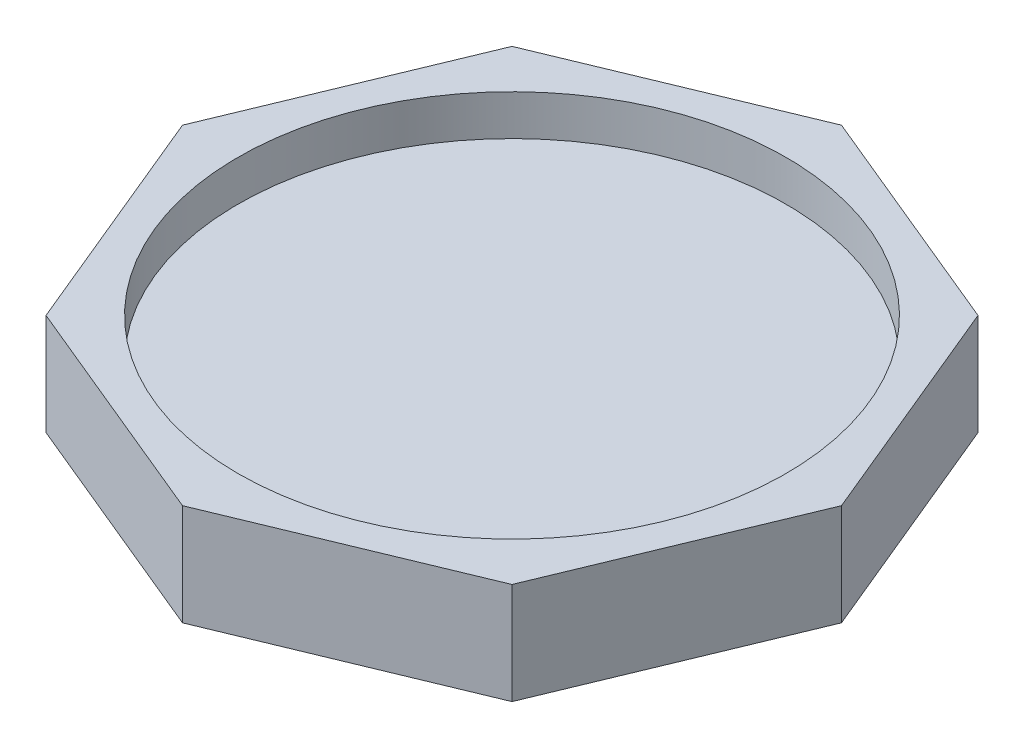
ISO-10303-21;
HEADER;
FILE_DESCRIPTION(('STEP AP214'),'2;1');
FILE_NAME('part.step','',(''),(''),'','','');
FILE_SCHEMA(('AUTOMOTIVE_DESIGN { 1 0 10303 214 1 1 1 1 }'));
ENDSEC;
DATA;
#1=APPLICATION_CONTEXT('core data for automotive mechanical design processes');
#2=APPLICATION_PROTOCOL_DEFINITION('international standard','automotive_design',2000,#1);
#3=PRODUCT_CONTEXT('',#1,'mechanical');
#4=PRODUCT('Part','Part','',(#3));
#5=PRODUCT_RELATED_PRODUCT_CATEGORY('part','',(#4));
#6=PRODUCT_DEFINITION_FORMATION('','',#4);
#7=PRODUCT_DEFINITION_CONTEXT('part definition',#1,'design');
#8=PRODUCT_DEFINITION('design','',#6,#7);
#9=PRODUCT_DEFINITION_SHAPE('','',#8);
#10=(LENGTH_UNIT() NAMED_UNIT(*) SI_UNIT(.MILLI.,.METRE.));
#11=(NAMED_UNIT(*) PLANE_ANGLE_UNIT() SI_UNIT($,.RADIAN.));
#12=(NAMED_UNIT(*) SI_UNIT($,.STERADIAN.) SOLID_ANGLE_UNIT());
#13=UNCERTAINTY_MEASURE_WITH_UNIT(LENGTH_MEASURE(1.E-05),#10,'distance_accuracy_value','');
#14=(GEOMETRIC_REPRESENTATION_CONTEXT(3) GLOBAL_UNCERTAINTY_ASSIGNED_CONTEXT((#13)) GLOBAL_UNIT_ASSIGNED_CONTEXT((#10,
#11,#12)) REPRESENTATION_CONTEXT('',''));
#15=CARTESIAN_POINT('',(0.,0.,0.));
#16=DIRECTION('',(0.,0.,1.));
#17=DIRECTION('',(1.,0.,0.));
#18=AXIS2_PLACEMENT_3D('',#15,#16,#17);
#19=CARTESIAN_POINT('',(114.805029709528,50.,114.805029709526));
#20=DIRECTION('',(-0.923879532511289,0.,-0.382683432365084));
#21=DIRECTION('',(-0.382683432365084,0.,0.923879532511289));
#22=AXIS2_PLACEMENT_3D('',#19,#20,#21);
#23=PLANE('',#22);
#24=DIRECTION('',(0.382683432365084,0.,-0.923879532511289));
#25=VECTOR('',#24,1.);
#26=CARTESIAN_POINT('',(114.805029709528,0.,114.805029709526));
#27=LINE('',#26,#25);
#28=CARTESIAN_POINT('',(114.805029709528,0.,114.805029709526));
#29=VERTEX_POINT('',#28);
#30=CARTESIAN_POINT('',(162.358830043859,0.,-1.012848828571E-12));
#31=VERTEX_POINT('',#30);
#32=EDGE_CURVE('E143',#29,#31,#27,.T.);
#33=ORIENTED_EDGE('',*,*,#32,.T.);
#34=DIRECTION('',(0.,-1.,0.));
#35=VECTOR('',#34,1.);
#36=CARTESIAN_POINT('',(162.358830043859,50.,-1.012848828571E-12));
#37=LINE('',#36,#35);
#38=CARTESIAN_POINT('',(162.358830043859,50.,-1.012848828571E-12));
#39=VERTEX_POINT('',#38);
#40=EDGE_CURVE('E11',#39,#31,#37,.T.);
#41=ORIENTED_EDGE('',*,*,#40,.F.);
#42=DIRECTION('',(0.382683432365084,0.,-0.923879532511289));
#43=VECTOR('',#42,1.);
#44=CARTESIAN_POINT('',(114.805029709528,50.,114.805029709526));
#45=LINE('',#44,#43);
#46=CARTESIAN_POINT('',(114.805029709528,50.,114.805029709526));
#47=VERTEX_POINT('',#46);
#48=EDGE_CURVE('E160',#47,#39,#45,.T.);
#49=ORIENTED_EDGE('',*,*,#48,.F.);
#50=DIRECTION('',(0.,-1.,0.));
#51=VECTOR('',#50,1.);
#52=CARTESIAN_POINT('',(114.805029709528,50.,114.805029709526));
#53=LINE('',#52,#51);
#54=EDGE_CURVE('E136',#47,#29,#53,.T.);
#55=ORIENTED_EDGE('',*,*,#54,.T.);
#56=EDGE_LOOP('',(#33,#41,#49,#55));
#57=FACE_BOUND('',#56,.T.);
#58=ADVANCED_FACE('F44',(#57),#23,.F.);
#59=CARTESIAN_POINT('',(162.358830043859,50.,-1.012848828571E-12));
#60=DIRECTION('',(-0.923879532511284,0.,0.382683432365096));
#61=DIRECTION('',(0.382683432365096,0.,0.923879532511284));
#62=AXIS2_PLACEMENT_3D('',#59,#60,#61);
#63=PLANE('',#62);
#64=DIRECTION('',(-0.382683432365096,0.,-0.923879532511284));
#65=VECTOR('',#64,1.);
#66=CARTESIAN_POINT('',(162.358830043859,0.,-1.012848828571E-12));
#67=LINE('',#66,#65);
#68=CARTESIAN_POINT('',(114.805029709526,0.,-114.805029709528));
#69=VERTEX_POINT('',#68);
#70=EDGE_CURVE('E145',#31,#69,#67,.T.);
#71=ORIENTED_EDGE('',*,*,#70,.T.);
#72=DIRECTION('',(0.,-1.,0.));
#73=VECTOR('',#72,1.);
#74=CARTESIAN_POINT('',(114.805029709526,50.,-114.805029709528));
#75=LINE('',#74,#73);
#76=CARTESIAN_POINT('',(114.805029709526,50.,-114.805029709528));
#77=VERTEX_POINT('',#76);
#78=EDGE_CURVE('E52',#77,#69,#75,.T.);
#79=ORIENTED_EDGE('',*,*,#78,.F.);
#80=DIRECTION('',(-0.382683432365096,0.,-0.923879532511284));
#81=VECTOR('',#80,1.);
#82=CARTESIAN_POINT('',(162.358830043859,50.,-1.012848828571E-12));
#83=LINE('',#82,#81);
#84=EDGE_CURVE('E102',#39,#77,#83,.T.);
#85=ORIENTED_EDGE('',*,*,#84,.F.);
#86=ORIENTED_EDGE('',*,*,#40,.T.);
#87=EDGE_LOOP('',(#71,#79,#85,#86));
#88=FACE_BOUND('',#87,.T.);
#89=ADVANCED_FACE('F216',(#88),#63,.F.);
#90=CARTESIAN_POINT('',(114.805029709526,50.,-114.805029709528));
#91=DIRECTION('',(-0.382683432365084,0.,0.923879532511289));
#92=DIRECTION('',(0.923879532511289,0.,0.382683432365084));
#93=AXIS2_PLACEMENT_3D('',#90,#91,#92);
#94=PLANE('',#93);
#95=DIRECTION('',(-0.923879532511289,0.,-0.382683432365084));
#96=VECTOR('',#95,1.);
#97=CARTESIAN_POINT('',(114.805029709526,0.,-114.805029709528));
#98=LINE('',#97,#96);
#99=CARTESIAN_POINT('',(-1.01368014967304E-12,0.,-162.358830043859));
#100=VERTEX_POINT('',#99);
#101=EDGE_CURVE('E150',#69,#100,#98,.T.);
#102=ORIENTED_EDGE('',*,*,#101,.T.);
#103=DIRECTION('',(0.,-1.,0.));
#104=VECTOR('',#103,1.);
#105=CARTESIAN_POINT('',(-1.01368014967304E-12,50.,-162.358830043859));
#106=LINE('',#105,#104);
#107=CARTESIAN_POINT('',(-1.01368014967304E-12,50.,-162.358830043859));
#108=VERTEX_POINT('',#107);
#109=EDGE_CURVE('E163',#108,#100,#106,.T.);
#110=ORIENTED_EDGE('',*,*,#109,.F.);
#111=DIRECTION('',(-0.923879532511289,0.,-0.382683432365084));
#112=VECTOR('',#111,1.);
#113=CARTESIAN_POINT('',(114.805029709526,50.,-114.805029709528));
#114=LINE('',#113,#112);
#115=EDGE_CURVE('E171',#77,#108,#114,.T.);
#116=ORIENTED_EDGE('',*,*,#115,.F.);
#117=ORIENTED_EDGE('',*,*,#78,.T.);
#118=EDGE_LOOP('',(#102,#110,#116,#117));
#119=FACE_BOUND('',#118,.T.);
#120=ADVANCED_FACE('F168',(#119),#94,.F.);
#121=CARTESIAN_POINT('',(-1.01368014967304E-12,50.,-162.358830043859));
#122=DIRECTION('',(0.382683432365096,0.,0.923879532511284));
#123=DIRECTION('',(0.923879532511284,0.,-0.382683432365096));
#124=AXIS2_PLACEMENT_3D('',#121,#122,#123);
#125=PLANE('',#124);
#126=DIRECTION('',(-0.923879532511284,0.,0.382683432365096));
#127=VECTOR('',#126,1.);
#128=CARTESIAN_POINT('',(-1.01368014967304E-12,0.,-162.358830043859));
#129=LINE('',#128,#127);
#130=CARTESIAN_POINT('',(-114.805029709528,0.,-114.805029709526));
#131=VERTEX_POINT('',#130);
#132=EDGE_CURVE('E149',#100,#131,#129,.T.);
#133=ORIENTED_EDGE('',*,*,#132,.T.);
#134=DIRECTION('',(0.,-1.,0.));
#135=VECTOR('',#134,1.);
#136=CARTESIAN_POINT('',(-114.805029709528,50.,-114.805029709526));
#137=LINE('',#136,#135);
#138=CARTESIAN_POINT('',(-114.805029709528,50.,-114.805029709526));
#139=VERTEX_POINT('',#138);
#140=EDGE_CURVE('E161',#139,#131,#137,.T.);
#141=ORIENTED_EDGE('',*,*,#140,.F.);
#142=DIRECTION('',(-0.923879532511284,0.,0.382683432365096));
#143=VECTOR('',#142,1.);
#144=CARTESIAN_POINT('',(-1.01368014967304E-12,50.,-162.358830043859));
#145=LINE('',#144,#143);
#146=EDGE_CURVE('E184',#108,#139,#145,.T.);
#147=ORIENTED_EDGE('',*,*,#146,.F.);
#148=ORIENTED_EDGE('',*,*,#109,.T.);
#149=EDGE_LOOP('',(#133,#141,#147,#148));
#150=FACE_BOUND('',#149,.T.);
#151=ADVANCED_FACE('F177',(#150),#125,.F.);
#152=CARTESIAN_POINT('',(-114.805029709528,50.,-114.805029709526));
#153=DIRECTION('',(0.923879532511289,0.,0.382683432365084));
#154=DIRECTION('',(0.382683432365084,0.,-0.92387953251129));
#155=AXIS2_PLACEMENT_3D('',#152,#153,#154);
#156=PLANE('',#155);
#157=DIRECTION('',(-0.382683432365084,0.,0.923879532511289));
#158=VECTOR('',#157,1.);
#159=CARTESIAN_POINT('',(-114.805029709528,0.,-114.805029709526));
#160=LINE('',#159,#158);
#161=CARTESIAN_POINT('',(-162.358830043859,0.,9.98994576244845E-13));
#162=VERTEX_POINT('',#161);
#163=EDGE_CURVE('E151',#131,#162,#160,.T.);
#164=ORIENTED_EDGE('',*,*,#163,.T.);
#165=DIRECTION('',(0.,-1.,0.));
#166=VECTOR('',#165,1.);
#167=CARTESIAN_POINT('',(-162.358830043859,50.,9.98994576244845E-13));
#168=LINE('',#167,#166);
#169=CARTESIAN_POINT('',(-162.358830043859,50.,9.98994576244845E-13));
#170=VERTEX_POINT('',#169);
#171=EDGE_CURVE('E131',#170,#162,#168,.T.);
#172=ORIENTED_EDGE('',*,*,#171,.F.);
#173=DIRECTION('',(-0.382683432365084,0.,0.923879532511289));
#174=VECTOR('',#173,1.);
#175=CARTESIAN_POINT('',(-114.805029709528,50.,-114.805029709526));
#176=LINE('',#175,#174);
#177=EDGE_CURVE('E125',#139,#170,#176,.T.);
#178=ORIENTED_EDGE('',*,*,#177,.F.);
#179=ORIENTED_EDGE('',*,*,#140,.T.);
#180=EDGE_LOOP('',(#164,#172,#178,#179));
#181=FACE_BOUND('',#180,.T.);
#182=ADVANCED_FACE('F181',(#181),#156,.F.);
#183=CARTESIAN_POINT('',(-162.358830043859,50.,9.98994576244845E-13));
#184=DIRECTION('',(0.923879532511284,0.,-0.382683432365096));
#185=DIRECTION('',(-0.382683432365096,0.,-0.923879532511284));
#186=AXIS2_PLACEMENT_3D('',#183,#184,#185);
#187=PLANE('',#186);
#188=DIRECTION('',(0.382683432365096,0.,0.923879532511284));
#189=VECTOR('',#188,1.);
#190=CARTESIAN_POINT('',(-162.358830043859,0.,9.98994576244845E-13));
#191=LINE('',#190,#189);
#192=CARTESIAN_POINT('',(-114.805029709526,0.,114.805029709528));
#193=VERTEX_POINT('',#192);
#194=EDGE_CURVE('E134',#162,#193,#191,.T.);
#195=ORIENTED_EDGE('',*,*,#194,.T.);
#196=DIRECTION('',(0.,-1.,0.));
#197=VECTOR('',#196,1.);
#198=CARTESIAN_POINT('',(-114.805029709526,50.,114.805029709528));
#199=LINE('',#198,#197);
#200=CARTESIAN_POINT('',(-114.805029709526,50.,114.805029709528));
#201=VERTEX_POINT('',#200);
#202=EDGE_CURVE('E126',#201,#193,#199,.T.);
#203=ORIENTED_EDGE('',*,*,#202,.F.);
#204=DIRECTION('',(0.382683432365096,0.,0.923879532511284));
#205=VECTOR('',#204,1.);
#206=CARTESIAN_POINT('',(-162.358830043859,50.,9.98994576244845E-13));
#207=LINE('',#206,#205);
#208=EDGE_CURVE('E116',#170,#201,#207,.T.);
#209=ORIENTED_EDGE('',*,*,#208,.F.);
#210=ORIENTED_EDGE('',*,*,#171,.T.);
#211=EDGE_LOOP('',(#195,#203,#209,#210));
#212=FACE_BOUND('',#211,.T.);
#213=ADVANCED_FACE('F129',(#212),#187,.F.);
#214=CARTESIAN_POINT('',(-114.805029709526,50.,114.805029709528));
#215=DIRECTION('',(0.382683432365084,0.,-0.923879532511289));
#216=DIRECTION('',(-0.923879532511289,0.,-0.382683432365084));
#217=AXIS2_PLACEMENT_3D('',#214,#215,#216);
#218=PLANE('',#217);
#219=DIRECTION('',(0.923879532511289,0.,0.382683432365084));
#220=VECTOR('',#219,1.);
#221=CARTESIAN_POINT('',(-114.805029709526,0.,114.805029709528));
#222=LINE('',#221,#220);
#223=CARTESIAN_POINT('',(1.04680734522975E-12,0.,162.358830043859));
#224=VERTEX_POINT('',#223);
#225=EDGE_CURVE('E89',#193,#224,#222,.T.);
#226=ORIENTED_EDGE('',*,*,#225,.T.);
#227=DIRECTION('',(0.,-1.,0.));
#228=VECTOR('',#227,1.);
#229=CARTESIAN_POINT('',(1.04680734522975E-12,50.,162.358830043859));
#230=LINE('',#229,#228);
#231=CARTESIAN_POINT('',(1.04680734522975E-12,50.,162.358830043859));
#232=VERTEX_POINT('',#231);
#233=EDGE_CURVE('E135',#232,#224,#230,.T.);
#234=ORIENTED_EDGE('',*,*,#233,.F.);
#235=DIRECTION('',(0.923879532511289,0.,0.382683432365084));
#236=VECTOR('',#235,1.);
#237=CARTESIAN_POINT('',(-114.805029709526,50.,114.805029709528));
#238=LINE('',#237,#236);
#239=EDGE_CURVE('E124',#201,#232,#238,.T.);
#240=ORIENTED_EDGE('',*,*,#239,.F.);
#241=ORIENTED_EDGE('',*,*,#202,.T.);
#242=EDGE_LOOP('',(#226,#234,#240,#241));
#243=FACE_BOUND('',#242,.T.);
#244=ADVANCED_FACE('F132',(#243),#218,.F.);
#245=CARTESIAN_POINT('',(1.04680734522975E-12,50.,162.358830043859));
#246=DIRECTION('',(-0.382683432365096,0.,-0.923879532511284));
#247=DIRECTION('',(-0.923879532511284,0.,0.382683432365096));
#248=AXIS2_PLACEMENT_3D('',#245,#246,#247);
#249=PLANE('',#248);
#250=DIRECTION('',(0.923879532511284,0.,-0.382683432365096));
#251=VECTOR('',#250,1.);
#252=CARTESIAN_POINT('',(1.04680734522975E-12,0.,162.358830043859));
#253=LINE('',#252,#251);
#254=EDGE_CURVE('E96',#224,#29,#253,.T.);
#255=ORIENTED_EDGE('',*,*,#254,.T.);
#256=ORIENTED_EDGE('',*,*,#54,.F.);
#257=DIRECTION('',(0.923879532511284,0.,-0.382683432365096));
#258=VECTOR('',#257,1.);
#259=CARTESIAN_POINT('',(1.04680734522975E-12,50.,162.358830043859));
#260=LINE('',#259,#258);
#261=EDGE_CURVE('E64',#232,#47,#260,.T.);
#262=ORIENTED_EDGE('',*,*,#261,.F.);
#263=ORIENTED_EDGE('',*,*,#233,.T.);
#264=EDGE_LOOP('',(#255,#256,#262,#263));
#265=FACE_BOUND('',#264,.T.);
#266=ADVANCED_FACE('F206',(#265),#249,.F.);
#267=CARTESIAN_POINT('',(0.,50.,0.));
#268=DIRECTION('',(0.,1.,0.));
#269=DIRECTION('',(0.,0.,1.));
#270=AXIS2_PLACEMENT_3D('',#267,#268,#269);
#271=PLANE('',#270);
#272=CARTESIAN_POINT('',(0.,50.,0.));
#273=DIRECTION('',(0.,1.,0.));
#274=DIRECTION('',(0.,0.,1.));
#275=AXIS2_PLACEMENT_3D('',#272,#273,#274);
#276=CIRCLE('',#275,135.);
#277=CARTESIAN_POINT('',(0.,50.,135.));
#278=VERTEX_POINT('',#277);
#279=EDGE_CURVE('E187',#278,#278,#276,.T.);
#280=ORIENTED_EDGE('',*,*,#279,.F.);
#281=EDGE_LOOP('',(#280));
#282=FACE_BOUND('',#281,.T.);
#283=ORIENTED_EDGE('',*,*,#48,.T.);
#284=ORIENTED_EDGE('',*,*,#84,.T.);
#285=ORIENTED_EDGE('',*,*,#115,.T.);
#286=ORIENTED_EDGE('',*,*,#146,.T.);
#287=ORIENTED_EDGE('',*,*,#177,.T.);
#288=ORIENTED_EDGE('',*,*,#208,.T.);
#289=ORIENTED_EDGE('',*,*,#239,.T.);
#290=ORIENTED_EDGE('',*,*,#261,.T.);
#291=EDGE_LOOP('',(#283,#284,#285,#286,#287,#288,#289,#290));
#292=FACE_BOUND('',#291,.T.);
#293=ADVANCED_FACE('F118',(#282,#292),#271,.T.);
#294=CARTESIAN_POINT('',(0.,0.,0.));
#295=DIRECTION('',(0.,1.,0.));
#296=DIRECTION('',(0.,0.,1.));
#297=AXIS2_PLACEMENT_3D('',#294,#295,#296);
#298=PLANE('',#297);
#299=ORIENTED_EDGE('',*,*,#32,.F.);
#300=ORIENTED_EDGE('',*,*,#254,.F.);
#301=ORIENTED_EDGE('',*,*,#225,.F.);
#302=ORIENTED_EDGE('',*,*,#194,.F.);
#303=ORIENTED_EDGE('',*,*,#163,.F.);
#304=ORIENTED_EDGE('',*,*,#132,.F.);
#305=ORIENTED_EDGE('',*,*,#101,.F.);
#306=ORIENTED_EDGE('',*,*,#70,.F.);
#307=EDGE_LOOP('',(#299,#300,#301,#302,#303,#304,#305,#306));
#308=FACE_BOUND('',#307,.T.);
#309=ADVANCED_FACE('F179',(#308),#298,.F.);
#310=CARTESIAN_POINT('',(0.,30.,0.));
#311=DIRECTION('',(0.,1.,0.));
#312=DIRECTION('',(0.,0.,1.));
#313=AXIS2_PLACEMENT_3D('',#310,#311,#312);
#314=CYLINDRICAL_SURFACE('',#313,135.);
#315=CARTESIAN_POINT('',(0.,30.,0.));
#316=DIRECTION('',(0.,1.,0.));
#317=DIRECTION('',(0.,0.,1.));
#318=AXIS2_PLACEMENT_3D('',#315,#316,#317);
#319=CIRCLE('',#318,135.);
#320=CARTESIAN_POINT('',(0.,30.,135.));
#321=VERTEX_POINT('',#320);
#322=EDGE_CURVE('E144',#321,#321,#319,.T.);
#323=ORIENTED_EDGE('',*,*,#322,.F.);
#324=EDGE_LOOP('',(#323));
#325=FACE_BOUND('',#324,.T.);
#326=ORIENTED_EDGE('',*,*,#279,.T.);
#327=EDGE_LOOP('',(#326));
#328=FACE_BOUND('',#327,.T.);
#329=ADVANCED_FACE('F200',(#325,#328),#314,.F.);
#330=CARTESIAN_POINT('',(0.,30.,0.));
#331=DIRECTION('',(0.,1.,0.));
#332=DIRECTION('',(0.,0.,1.));
#333=AXIS2_PLACEMENT_3D('',#330,#331,#332);
#334=PLANE('',#333);
#335=ORIENTED_EDGE('',*,*,#322,.T.);
#336=EDGE_LOOP('',(#335));
#337=FACE_BOUND('',#336,.T.);
#338=ADVANCED_FACE('F197',(#337),#334,.T.);
#339=CLOSED_SHELL('',(#58,#89,#120,#151,#182,#213,#244,#266,#293,#309,#329,#338));
#340=MANIFOLD_SOLID_BREP('B2',#339);
#341=ADVANCED_BREP_SHAPE_REPRESENTATION('',(#18,#340),#14);
#342=SHAPE_DEFINITION_REPRESENTATION(#9,#341);
ENDSEC;
END-ISO-10303-21;
